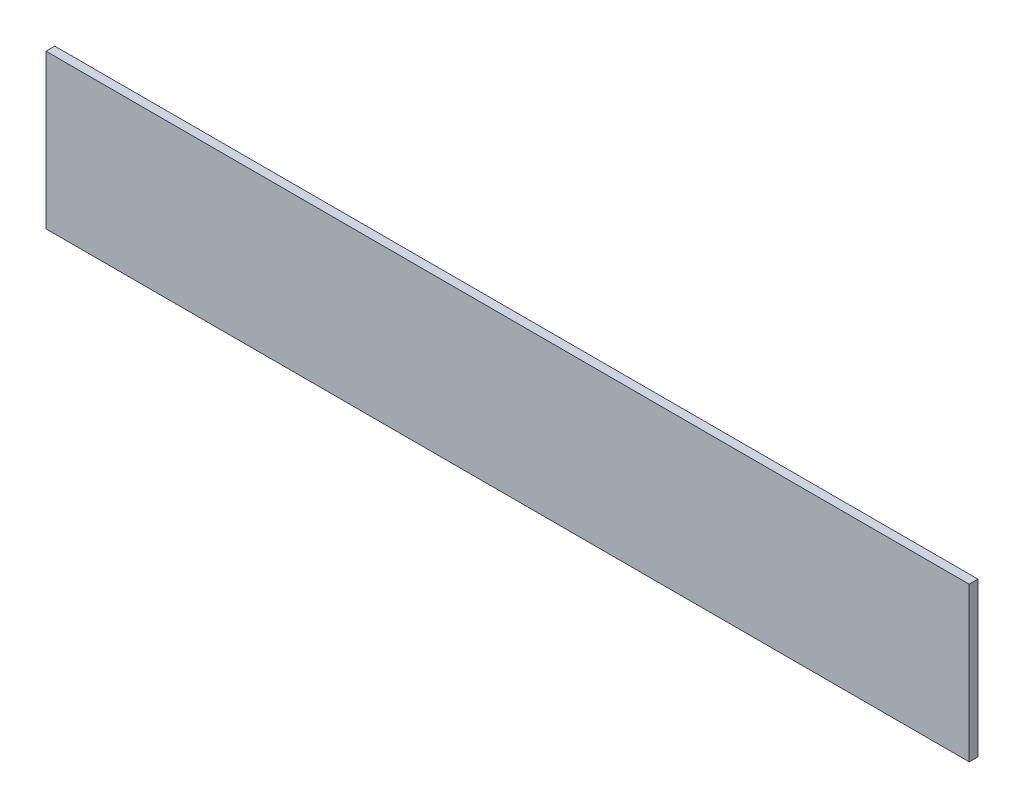
ISO-10303-21;
HEADER;
FILE_DESCRIPTION(('STEP AP214'),'2;1');
FILE_NAME('part.step','',(''),(''),'','','');
FILE_SCHEMA(('AUTOMOTIVE_DESIGN { 1 0 10303 214 1 1 1 1 }'));
ENDSEC;
DATA;
#1=APPLICATION_CONTEXT('core data for automotive mechanical design processes');
#2=APPLICATION_PROTOCOL_DEFINITION('international standard','automotive_design',2000,#1);
#3=PRODUCT_CONTEXT('',#1,'mechanical');
#4=PRODUCT('Part','Part','',(#3));
#5=PRODUCT_RELATED_PRODUCT_CATEGORY('part','',(#4));
#6=PRODUCT_DEFINITION_FORMATION('','',#4);
#7=PRODUCT_DEFINITION_CONTEXT('part definition',#1,'design');
#8=PRODUCT_DEFINITION('design','',#6,#7);
#9=PRODUCT_DEFINITION_SHAPE('','',#8);
#10=(LENGTH_UNIT() NAMED_UNIT(*) SI_UNIT(.MILLI.,.METRE.));
#11=(NAMED_UNIT(*) PLANE_ANGLE_UNIT() SI_UNIT($,.RADIAN.));
#12=(NAMED_UNIT(*) SI_UNIT($,.STERADIAN.) SOLID_ANGLE_UNIT());
#13=UNCERTAINTY_MEASURE_WITH_UNIT(LENGTH_MEASURE(1.E-05),#10,'distance_accuracy_value','');
#14=(GEOMETRIC_REPRESENTATION_CONTEXT(3) GLOBAL_UNCERTAINTY_ASSIGNED_CONTEXT((#13)) GLOBAL_UNIT_ASSIGNED_CONTEXT((#10,
#11,#12)) REPRESENTATION_CONTEXT('',''));
#15=CARTESIAN_POINT('',(0.,0.,0.));
#16=DIRECTION('',(0.,0.,1.));
#17=DIRECTION('',(1.,0.,0.));
#18=AXIS2_PLACEMENT_3D('',#15,#16,#17);
#19=CARTESIAN_POINT('',(-65.8752784066792,33.2014711656825,2.54));
#20=DIRECTION('',(1.,0.,0.));
#21=DIRECTION('',(0.,0.,-1.));
#22=AXIS2_PLACEMENT_3D('',#19,#20,#21);
#23=PLANE('',#22);
#24=DIRECTION('',(0.,-1.,0.));
#25=VECTOR('',#24,1.);
#26=CARTESIAN_POINT('',(-65.8752784066792,33.2014711656825,0.));
#27=LINE('',#26,#25);
#28=CARTESIAN_POINT('',(-65.8752784066792,33.2014711656825,0.));
#29=VERTEX_POINT('',#28);
#30=CARTESIAN_POINT('',(-65.8752784066792,-11.2485288343175,0.));
#31=VERTEX_POINT('',#30);
#32=EDGE_CURVE('E94',#29,#31,#27,.T.);
#33=ORIENTED_EDGE('',*,*,#32,.T.);
#34=DIRECTION('',(0.,0.,-1.));
#35=VECTOR('',#34,1.);
#36=CARTESIAN_POINT('',(-65.8752784066792,-11.2485288343175,2.54));
#37=LINE('',#36,#35);
#38=CARTESIAN_POINT('',(-65.8752784066792,-11.2485288343175,2.54));
#39=VERTEX_POINT('',#38);
#40=EDGE_CURVE('E11',#39,#31,#37,.T.);
#41=ORIENTED_EDGE('',*,*,#40,.F.);
#42=DIRECTION('',(0.,-1.,0.));
#43=VECTOR('',#42,1.);
#44=CARTESIAN_POINT('',(-65.8752784066792,33.2014711656825,2.54));
#45=LINE('',#44,#43);
#46=CARTESIAN_POINT('',(-65.8752784066792,33.2014711656825,2.54));
#47=VERTEX_POINT('',#46);
#48=EDGE_CURVE('E82',#47,#39,#45,.T.);
#49=ORIENTED_EDGE('',*,*,#48,.F.);
#50=DIRECTION('',(0.,0.,-1.));
#51=VECTOR('',#50,1.);
#52=CARTESIAN_POINT('',(-65.8752784066792,33.2014711656825,2.54));
#53=LINE('',#52,#51);
#54=EDGE_CURVE('E90',#47,#29,#53,.T.);
#55=ORIENTED_EDGE('',*,*,#54,.T.);
#56=EDGE_LOOP('',(#33,#41,#49,#55));
#57=FACE_BOUND('',#56,.T.);
#58=ADVANCED_FACE('F31',(#57),#23,.F.);
#59=CARTESIAN_POINT('',(-65.8752784066792,-11.2485288343175,2.54));
#60=DIRECTION('',(0.,1.,0.));
#61=DIRECTION('',(0.,0.,1.));
#62=AXIS2_PLACEMENT_3D('',#59,#60,#61);
#63=PLANE('',#62);
#64=DIRECTION('',(1.,0.,0.));
#65=VECTOR('',#64,1.);
#66=CARTESIAN_POINT('',(-65.8752784066792,-11.2485288343175,0.));
#67=LINE('',#66,#65);
#68=CARTESIAN_POINT('',(200.824721593321,-11.2485288343175,0.));
#69=VERTEX_POINT('',#68);
#70=EDGE_CURVE('E86',#31,#69,#67,.T.);
#71=ORIENTED_EDGE('',*,*,#70,.T.);
#72=DIRECTION('',(0.,0.,-1.));
#73=VECTOR('',#72,1.);
#74=CARTESIAN_POINT('',(200.824721593321,-11.2485288343175,2.54));
#75=LINE('',#74,#73);
#76=CARTESIAN_POINT('',(200.824721593321,-11.2485288343175,2.54));
#77=VERTEX_POINT('',#76);
#78=EDGE_CURVE('E39',#77,#69,#75,.T.);
#79=ORIENTED_EDGE('',*,*,#78,.F.);
#80=DIRECTION('',(1.,0.,0.));
#81=VECTOR('',#80,1.);
#82=CARTESIAN_POINT('',(-65.8752784066792,-11.2485288343175,2.54));
#83=LINE('',#82,#81);
#84=EDGE_CURVE('E77',#39,#77,#83,.T.);
#85=ORIENTED_EDGE('',*,*,#84,.F.);
#86=ORIENTED_EDGE('',*,*,#40,.T.);
#87=EDGE_LOOP('',(#71,#79,#85,#86));
#88=FACE_BOUND('',#87,.T.);
#89=ADVANCED_FACE('F85',(#88),#63,.F.);
#90=CARTESIAN_POINT('',(200.824721593321,33.2014711656825,2.54));
#91=DIRECTION('',(-1.,0.,0.));
#92=DIRECTION('',(0.,0.,1.));
#93=AXIS2_PLACEMENT_3D('',#90,#91,#92);
#94=PLANE('',#93);
#95=DIRECTION('',(0.,1.,0.));
#96=VECTOR('',#95,1.);
#97=CARTESIAN_POINT('',(200.824721593321,33.2014711656825,0.));
#98=LINE('',#97,#96);
#99=CARTESIAN_POINT('',(200.824721593321,33.2014711656825,0.));
#100=VERTEX_POINT('',#99);
#101=EDGE_CURVE('E64',#69,#100,#98,.T.);
#102=ORIENTED_EDGE('',*,*,#101,.T.);
#103=DIRECTION('',(0.,0.,-1.));
#104=VECTOR('',#103,1.);
#105=CARTESIAN_POINT('',(200.824721593321,33.2014711656825,2.54));
#106=LINE('',#105,#104);
#107=CARTESIAN_POINT('',(200.824721593321,33.2014711656825,2.54));
#108=VERTEX_POINT('',#107);
#109=EDGE_CURVE('E87',#108,#100,#106,.T.);
#110=ORIENTED_EDGE('',*,*,#109,.F.);
#111=DIRECTION('',(0.,1.,0.));
#112=VECTOR('',#111,1.);
#113=CARTESIAN_POINT('',(200.824721593321,33.2014711656825,2.54));
#114=LINE('',#113,#112);
#115=EDGE_CURVE('E80',#77,#108,#114,.T.);
#116=ORIENTED_EDGE('',*,*,#115,.F.);
#117=ORIENTED_EDGE('',*,*,#78,.T.);
#118=EDGE_LOOP('',(#102,#110,#116,#117));
#119=FACE_BOUND('',#118,.T.);
#120=ADVANCED_FACE('F88',(#119),#94,.F.);
#121=CARTESIAN_POINT('',(-65.8752784066792,33.2014711656825,2.54));
#122=DIRECTION('',(0.,-1.,0.));
#123=DIRECTION('',(0.,0.,-1.));
#124=AXIS2_PLACEMENT_3D('',#121,#122,#123);
#125=PLANE('',#124);
#126=DIRECTION('',(-1.,0.,0.));
#127=VECTOR('',#126,1.);
#128=CARTESIAN_POINT('',(-65.8752784066792,33.2014711656825,0.));
#129=LINE('',#128,#127);
#130=EDGE_CURVE('E70',#100,#29,#129,.T.);
#131=ORIENTED_EDGE('',*,*,#130,.T.);
#132=ORIENTED_EDGE('',*,*,#54,.F.);
#133=DIRECTION('',(-1.,0.,0.));
#134=VECTOR('',#133,1.);
#135=CARTESIAN_POINT('',(-65.8752784066792,33.2014711656825,2.54));
#136=LINE('',#135,#134);
#137=EDGE_CURVE('E47',#108,#47,#136,.T.);
#138=ORIENTED_EDGE('',*,*,#137,.F.);
#139=ORIENTED_EDGE('',*,*,#109,.T.);
#140=EDGE_LOOP('',(#131,#132,#138,#139));
#141=FACE_BOUND('',#140,.T.);
#142=ADVANCED_FACE('F101',(#141),#125,.F.);
#143=CARTESIAN_POINT('',(-65.8752784066792,-11.2485288343175,2.54));
#144=DIRECTION('',(0.,0.,1.));
#145=DIRECTION('',(1.,0.,0.));
#146=AXIS2_PLACEMENT_3D('',#143,#144,#145);
#147=PLANE('',#146);
#148=ORIENTED_EDGE('',*,*,#48,.T.);
#149=ORIENTED_EDGE('',*,*,#84,.T.);
#150=ORIENTED_EDGE('',*,*,#115,.T.);
#151=ORIENTED_EDGE('',*,*,#137,.T.);
#152=EDGE_LOOP('',(#148,#149,#150,#151));
#153=FACE_BOUND('',#152,.T.);
#154=ADVANCED_FACE('F78',(#153),#147,.T.);
#155=CARTESIAN_POINT('',(-65.8752784066792,-11.2485288343175,0.));
#156=DIRECTION('',(0.,0.,1.));
#157=DIRECTION('',(1.,0.,0.));
#158=AXIS2_PLACEMENT_3D('',#155,#156,#157);
#159=PLANE('',#158);
#160=ORIENTED_EDGE('',*,*,#32,.F.);
#161=ORIENTED_EDGE('',*,*,#130,.F.);
#162=ORIENTED_EDGE('',*,*,#101,.F.);
#163=ORIENTED_EDGE('',*,*,#70,.F.);
#164=EDGE_LOOP('',(#160,#161,#162,#163));
#165=FACE_BOUND('',#164,.T.);
#166=ADVANCED_FACE('F104',(#165),#159,.F.);
#167=CLOSED_SHELL('',(#58,#89,#120,#142,#154,#166));
#168=MANIFOLD_SOLID_BREP('B2',#167);
#169=ADVANCED_BREP_SHAPE_REPRESENTATION('',(#18,#168),#14);
#170=SHAPE_DEFINITION_REPRESENTATION(#9,#169);
ENDSEC;
END-ISO-10303-21;
